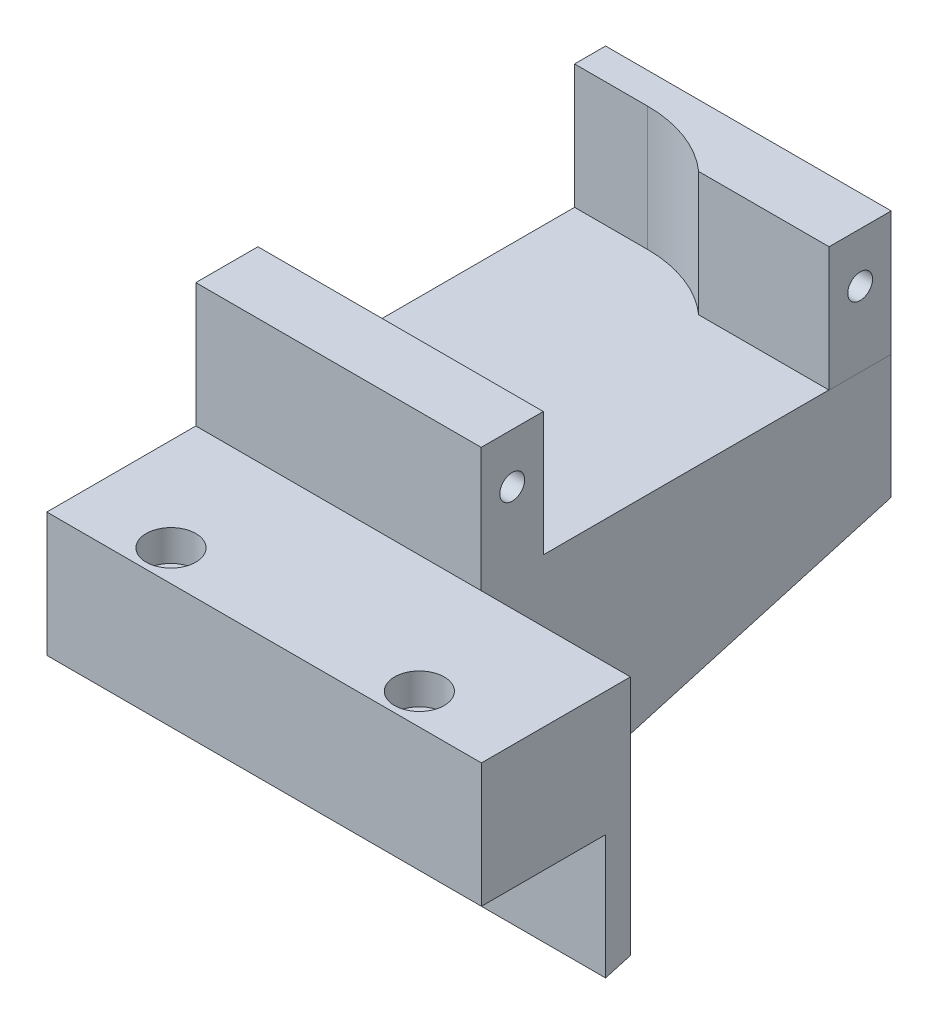
ISO-10303-21;
HEADER;
FILE_DESCRIPTION(('STEP AP214'),'2;1');
FILE_NAME('part.step','',(''),(''),'','','');
FILE_SCHEMA(('AUTOMOTIVE_DESIGN { 1 0 10303 214 1 1 1 1 }'));
ENDSEC;
DATA;
#1=APPLICATION_CONTEXT('core data for automotive mechanical design processes');
#2=APPLICATION_PROTOCOL_DEFINITION('international standard','automotive_design',2000,#1);
#3=PRODUCT_CONTEXT('',#1,'mechanical');
#4=PRODUCT('Part','Part','',(#3));
#5=PRODUCT_RELATED_PRODUCT_CATEGORY('part','',(#4));
#6=PRODUCT_DEFINITION_FORMATION('','',#4);
#7=PRODUCT_DEFINITION_CONTEXT('part definition',#1,'design');
#8=PRODUCT_DEFINITION('design','',#6,#7);
#9=PRODUCT_DEFINITION_SHAPE('','',#8);
#10=(LENGTH_UNIT() NAMED_UNIT(*) SI_UNIT(.MILLI.,.METRE.));
#11=(NAMED_UNIT(*) PLANE_ANGLE_UNIT() SI_UNIT($,.RADIAN.));
#12=(NAMED_UNIT(*) SI_UNIT($,.STERADIAN.) SOLID_ANGLE_UNIT());
#13=UNCERTAINTY_MEASURE_WITH_UNIT(LENGTH_MEASURE(1.E-05),#10,'distance_accuracy_value','');
#14=(GEOMETRIC_REPRESENTATION_CONTEXT(3) GLOBAL_UNCERTAINTY_ASSIGNED_CONTEXT((#13)) GLOBAL_UNIT_ASSIGNED_CONTEXT((#10,
#11,#12)) REPRESENTATION_CONTEXT('',''));
#15=CARTESIAN_POINT('',(0.,0.,0.));
#16=DIRECTION('',(0.,0.,1.));
#17=DIRECTION('',(1.,0.,0.));
#18=AXIS2_PLACEMENT_3D('',#15,#16,#17);
#19=CARTESIAN_POINT('',(-10.,10.,2.5));
#20=DIRECTION('',(0.,-1.,0.));
#21=DIRECTION('',(0.,0.,-1.));
#22=AXIS2_PLACEMENT_3D('',#19,#20,#21);
#23=CYLINDRICAL_SURFACE('',#22,1.1);
#24=CARTESIAN_POINT('',(-10.,0.,2.5));
#25=DIRECTION('',(0.,1.,0.));
#26=DIRECTION('',(0.,0.,1.));
#27=AXIS2_PLACEMENT_3D('',#24,#25,#26);
#28=CIRCLE('',#27,1.1);
#29=CARTESIAN_POINT('',(-10.,0.,3.6));
#30=VERTEX_POINT('',#29);
#31=EDGE_CURVE('E234',#30,#30,#28,.T.);
#32=ORIENTED_EDGE('',*,*,#31,.F.);
#33=EDGE_LOOP('',(#32));
#34=FACE_BOUND('',#33,.T.);
#35=CARTESIAN_POINT('',(-10.,7.5,2.5));
#36=DIRECTION('',(0.,1.,0.));
#37=DIRECTION('',(0.,0.,1.));
#38=AXIS2_PLACEMENT_3D('',#35,#36,#37);
#39=CIRCLE('',#38,1.1);
#40=CARTESIAN_POINT('',(-10.,7.5,3.6));
#41=VERTEX_POINT('',#40);
#42=EDGE_CURVE('E43',#41,#41,#39,.T.);
#43=ORIENTED_EDGE('',*,*,#42,.T.);
#44=EDGE_LOOP('',(#43));
#45=FACE_BOUND('',#44,.T.);
#46=ADVANCED_FACE('F39',(#34,#45),#23,.F.);
#47=CARTESIAN_POINT('',(9.99999999999999,10.,2.5));
#48=DIRECTION('',(0.,-1.,0.));
#49=DIRECTION('',(0.,0.,-1.));
#50=AXIS2_PLACEMENT_3D('',#47,#48,#49);
#51=CYLINDRICAL_SURFACE('',#50,1.1);
#52=CARTESIAN_POINT('',(9.99999999999999,0.,2.5));
#53=DIRECTION('',(0.,1.,0.));
#54=DIRECTION('',(0.,0.,1.));
#55=AXIS2_PLACEMENT_3D('',#52,#53,#54);
#56=CIRCLE('',#55,1.1);
#57=CARTESIAN_POINT('',(9.99999999999999,0.,3.6));
#58=VERTEX_POINT('',#57);
#59=EDGE_CURVE('E230',#58,#58,#56,.T.);
#60=ORIENTED_EDGE('',*,*,#59,.F.);
#61=EDGE_LOOP('',(#60));
#62=FACE_BOUND('',#61,.T.);
#63=CARTESIAN_POINT('',(9.99999999999999,7.5,2.5));
#64=DIRECTION('',(0.,1.,0.));
#65=DIRECTION('',(0.,0.,1.));
#66=AXIS2_PLACEMENT_3D('',#63,#64,#65);
#67=CIRCLE('',#66,1.1);
#68=CARTESIAN_POINT('',(9.99999999999999,7.5,3.6));
#69=VERTEX_POINT('',#68);
#70=EDGE_CURVE('E279',#69,#69,#67,.T.);
#71=ORIENTED_EDGE('',*,*,#70,.T.);
#72=EDGE_LOOP('',(#71));
#73=FACE_BOUND('',#72,.T.);
#74=ADVANCED_FACE('F464',(#62,#73),#51,.F.);
#75=CARTESIAN_POINT('',(-17.5,20.,-35.));
#76=DIRECTION('',(0.,0.,-1.));
#77=DIRECTION('',(-1.,0.,0.));
#78=AXIS2_PLACEMENT_3D('',#75,#76,#77);
#79=PLANE('',#78);
#80=DIRECTION('',(0.,1.,0.));
#81=VECTOR('',#80,1.);
#82=CARTESIAN_POINT('',(-5.00000000000001,10.,-35.));
#83=LINE('',#82,#81);
#84=CARTESIAN_POINT('',(-5.00000000000001,10.,-35.));
#85=VERTEX_POINT('',#84);
#86=CARTESIAN_POINT('',(-5.00000000000001,20.,-35.));
#87=VERTEX_POINT('',#86);
#88=EDGE_CURVE('E160',#85,#87,#83,.T.);
#89=ORIENTED_EDGE('',*,*,#88,.F.);
#90=DIRECTION('',(1.,0.,0.));
#91=VECTOR('',#90,1.);
#92=CARTESIAN_POINT('',(-17.5,10.,-35.));
#93=LINE('',#92,#91);
#94=CARTESIAN_POINT('',(5.48115762634183,10.,-35.));
#95=VERTEX_POINT('',#94);
#96=EDGE_CURVE('E168',#85,#95,#93,.T.);
#97=ORIENTED_EDGE('',*,*,#96,.T.);
#98=DIRECTION('',(-1.,0.,0.));
#99=VECTOR('',#98,1.);
#100=CARTESIAN_POINT('',(-17.5,10.,-35.));
#101=LINE('',#100,#99);
#102=CARTESIAN_POINT('',(5.49999999999999,10.,-35.));
#103=VERTEX_POINT('',#102);
#104=EDGE_CURVE('E344',#103,#95,#101,.T.);
#105=ORIENTED_EDGE('',*,*,#104,.F.);
#106=DIRECTION('',(0.,-1.,0.));
#107=VECTOR('',#106,1.);
#108=CARTESIAN_POINT('',(5.49999999999999,20.,-35.));
#109=LINE('',#108,#107);
#110=CARTESIAN_POINT('',(5.49999999999999,20.,-35.));
#111=VERTEX_POINT('',#110);
#112=EDGE_CURVE('E200',#111,#103,#109,.T.);
#113=ORIENTED_EDGE('',*,*,#112,.F.);
#114=DIRECTION('',(1.,0.,0.));
#115=VECTOR('',#114,1.);
#116=CARTESIAN_POINT('',(-17.5,20.,-35.));
#117=LINE('',#116,#115);
#118=EDGE_CURVE('E171',#87,#111,#117,.T.);
#119=ORIENTED_EDGE('',*,*,#118,.F.);
#120=EDGE_LOOP('',(#89,#97,#105,#113,#119));
#121=FACE_BOUND('',#120,.T.);
#122=ADVANCED_FACE('F166',(#121),#79,.F.);
#123=CARTESIAN_POINT('',(0.,10.,0.));
#124=DIRECTION('',(0.,1.,0.));
#125=DIRECTION('',(0.,0.,1.));
#126=AXIS2_PLACEMENT_3D('',#123,#124,#125);
#127=PLANE('',#126);
#128=ORIENTED_EDGE('',*,*,#96,.F.);
#129=CARTESIAN_POINT('',(-11.6143782776615,10.,-27.5));
#130=DIRECTION('',(0.,1.,0.));
#131=DIRECTION('',(0.,0.,1.));
#132=AXIS2_PLACEMENT_3D('',#129,#130,#131);
#133=CIRCLE('',#132,10.);
#134=CARTESIAN_POINT('',(-11.6143782776615,10.,-37.5));
#135=VERTEX_POINT('',#134);
#136=EDGE_CURVE('E64',#85,#135,#133,.T.);
#137=ORIENTED_EDGE('',*,*,#136,.T.);
#138=DIRECTION('',(-1.,0.,0.));
#139=VECTOR('',#138,1.);
#140=CARTESIAN_POINT('',(-5.00000000000001,10.,-37.5));
#141=LINE('',#140,#139);
#142=CARTESIAN_POINT('',(-17.5,10.,-37.5));
#143=VERTEX_POINT('',#142);
#144=EDGE_CURVE('E308',#135,#143,#141,.T.);
#145=ORIENTED_EDGE('',*,*,#144,.T.);
#146=DIRECTION('',(0.,0.,1.));
#147=VECTOR('',#146,1.);
#148=CARTESIAN_POINT('',(-17.5,10.,-40.));
#149=LINE('',#148,#147);
#150=CARTESIAN_POINT('',(-17.5,10.,-12.));
#151=VERTEX_POINT('',#150);
#152=EDGE_CURVE('E245',#143,#151,#149,.T.);
#153=ORIENTED_EDGE('',*,*,#152,.T.);
#154=DIRECTION('',(-1.,0.,0.));
#155=VECTOR('',#154,1.);
#156=CARTESIAN_POINT('',(-17.5,10.,-12.));
#157=LINE('',#156,#155);
#158=CARTESIAN_POINT('',(5.48115762634183,10.,-12.));
#159=VERTEX_POINT('',#158);
#160=EDGE_CURVE('E353',#159,#151,#157,.T.);
#161=ORIENTED_EDGE('',*,*,#160,.F.);
#162=DIRECTION('',(0.,0.,1.));
#163=VECTOR('',#162,1.);
#164=CARTESIAN_POINT('',(5.48115762634183,10.,-7.));
#165=LINE('',#164,#163);
#166=EDGE_CURVE('E179',#95,#159,#165,.T.);
#167=ORIENTED_EDGE('',*,*,#166,.F.);
#168=EDGE_LOOP('',(#128,#137,#145,#153,#161,#167));
#169=FACE_BOUND('',#168,.T.);
#170=ADVANCED_FACE('F177',(#169),#127,.T.);
#171=CARTESIAN_POINT('',(9.99999999999999,10.,2.5));
#172=DIRECTION('',(0.,1.,0.));
#173=DIRECTION('',(0.,0.,1.));
#174=AXIS2_PLACEMENT_3D('',#171,#172,#173);
#175=CIRCLE('',#174,2.);
#176=CARTESIAN_POINT('',(9.99999999999999,10.,4.5));
#177=VERTEX_POINT('',#176);
#178=EDGE_CURVE('E289',#177,#177,#175,.T.);
#179=ORIENTED_EDGE('',*,*,#178,.F.);
#180=EDGE_LOOP('',(#179));
#181=FACE_BOUND('',#180,.T.);
#182=CARTESIAN_POINT('',(-10.,10.,2.5));
#183=DIRECTION('',(0.,1.,0.));
#184=DIRECTION('',(0.,0.,1.));
#185=AXIS2_PLACEMENT_3D('',#182,#183,#184);
#186=CIRCLE('',#185,2.);
#187=CARTESIAN_POINT('',(-10.,10.,4.5));
#188=VERTEX_POINT('',#187);
#189=EDGE_CURVE('E301',#188,#188,#186,.T.);
#190=ORIENTED_EDGE('',*,*,#189,.F.);
#191=EDGE_LOOP('',(#190));
#192=FACE_BOUND('',#191,.T.);
#193=DIRECTION('',(1.,0.,0.));
#194=VECTOR('',#193,1.);
#195=CARTESIAN_POINT('',(5.48115762634183,10.,-7.));
#196=LINE('',#195,#194);
#197=CARTESIAN_POINT('',(5.48115762634183,10.,-7.));
#198=VERTEX_POINT('',#197);
#199=CARTESIAN_POINT('',(17.5,10.,-7.));
#200=VERTEX_POINT('',#199);
#201=EDGE_CURVE('E333',#198,#200,#196,.T.);
#202=ORIENTED_EDGE('',*,*,#201,.F.);
#203=DIRECTION('',(1.,0.,0.));
#204=VECTOR('',#203,1.);
#205=CARTESIAN_POINT('',(-17.5,10.,-7.));
#206=LINE('',#205,#204);
#207=CARTESIAN_POINT('',(-17.5,10.,-7.));
#208=VERTEX_POINT('',#207);
#209=EDGE_CURVE('E359',#208,#198,#206,.T.);
#210=ORIENTED_EDGE('',*,*,#209,.F.);
#211=CARTESIAN_POINT('',(-17.5,10.,5.));
#212=VERTEX_POINT('',#211);
#213=EDGE_CURVE('E243',#208,#212,#149,.T.);
#214=ORIENTED_EDGE('',*,*,#213,.T.);
#215=DIRECTION('',(1.,0.,0.));
#216=VECTOR('',#215,1.);
#217=CARTESIAN_POINT('',(-17.5,10.,5.));
#218=LINE('',#217,#216);
#219=CARTESIAN_POINT('',(17.5,10.,5.));
#220=VERTEX_POINT('',#219);
#221=EDGE_CURVE('E248',#212,#220,#218,.T.);
#222=ORIENTED_EDGE('',*,*,#221,.T.);
#223=DIRECTION('',(0.,0.,-1.));
#224=VECTOR('',#223,1.);
#225=CARTESIAN_POINT('',(17.5,10.,-40.));
#226=LINE('',#225,#224);
#227=EDGE_CURVE('E239',#220,#200,#226,.T.);
#228=ORIENTED_EDGE('',*,*,#227,.T.);
#229=EDGE_LOOP('',(#202,#210,#214,#222,#228));
#230=FACE_BOUND('',#229,.T.);
#231=ADVANCED_FACE('F444',(#181,#192,#230),#127,.T.);
#232=CARTESIAN_POINT('',(0.,0.,0.));
#233=DIRECTION('',(0.,1.,0.));
#234=DIRECTION('',(0.,0.,1.));
#235=AXIS2_PLACEMENT_3D('',#232,#233,#234);
#236=PLANE('',#235);
#237=ORIENTED_EDGE('',*,*,#59,.T.);
#238=EDGE_LOOP('',(#237));
#239=FACE_BOUND('',#238,.T.);
#240=ORIENTED_EDGE('',*,*,#31,.T.);
#241=EDGE_LOOP('',(#240));
#242=FACE_BOUND('',#241,.T.);
#243=DIRECTION('',(-1.,0.,0.));
#244=VECTOR('',#243,1.);
#245=CARTESIAN_POINT('',(-17.5,0.,-5.));
#246=LINE('',#245,#244);
#247=CARTESIAN_POINT('',(17.5,0.,-5.00000000000002));
#248=VERTEX_POINT('',#247);
#249=CARTESIAN_POINT('',(-17.5,0.,-5.));
#250=VERTEX_POINT('',#249);
#251=EDGE_CURVE('E215',#248,#250,#246,.T.);
#252=ORIENTED_EDGE('',*,*,#251,.F.);
#253=DIRECTION('',(0.,0.,-1.));
#254=VECTOR('',#253,1.);
#255=CARTESIAN_POINT('',(17.5,0.,-40.));
#256=LINE('',#255,#254);
#257=CARTESIAN_POINT('',(17.5,0.,5.));
#258=VERTEX_POINT('',#257);
#259=EDGE_CURVE('E238',#258,#248,#256,.T.);
#260=ORIENTED_EDGE('',*,*,#259,.F.);
#261=DIRECTION('',(1.,0.,0.));
#262=VECTOR('',#261,1.);
#263=CARTESIAN_POINT('',(-17.5,0.,5.));
#264=LINE('',#263,#262);
#265=CARTESIAN_POINT('',(-17.5,0.,5.));
#266=VERTEX_POINT('',#265);
#267=EDGE_CURVE('E244',#266,#258,#264,.T.);
#268=ORIENTED_EDGE('',*,*,#267,.F.);
#269=DIRECTION('',(0.,0.,1.));
#270=VECTOR('',#269,1.);
#271=CARTESIAN_POINT('',(-17.5,0.,-40.));
#272=LINE('',#271,#270);
#273=EDGE_CURVE('E255',#250,#266,#272,.T.);
#274=ORIENTED_EDGE('',*,*,#273,.F.);
#275=EDGE_LOOP('',(#252,#260,#268,#274));
#276=FACE_BOUND('',#275,.T.);
#277=ADVANCED_FACE('F427',(#239,#242,#276),#236,.F.);
#278=CARTESIAN_POINT('',(17.5,10.,-40.));
#279=DIRECTION('',(-1.,0.,0.));
#280=DIRECTION('',(0.,0.,1.));
#281=AXIS2_PLACEMENT_3D('',#278,#279,#280);
#282=PLANE('',#281);
#283=DIRECTION('',(0.,-0.274721127897378,0.961523947640823));
#284=VECTOR('',#283,1.);
#285=CARTESIAN_POINT('',(17.5,-10.,-5.));
#286=LINE('',#285,#284);
#287=CARTESIAN_POINT('',(17.5,-9.42857142857143,-7.));
#288=VERTEX_POINT('',#287);
#289=CARTESIAN_POINT('',(17.5,-10.,-5.));
#290=VERTEX_POINT('',#289);
#291=EDGE_CURVE('E204',#288,#290,#286,.T.);
#292=ORIENTED_EDGE('',*,*,#291,.F.);
#293=DIRECTION('',(0.,1.,0.));
#294=VECTOR('',#293,1.);
#295=CARTESIAN_POINT('',(17.5,-30.,-7.));
#296=LINE('',#295,#294);
#297=EDGE_CURVE('E345',#288,#200,#296,.T.);
#298=ORIENTED_EDGE('',*,*,#297,.T.);
#299=ORIENTED_EDGE('',*,*,#227,.F.);
#300=DIRECTION('',(0.,-1.,0.));
#301=VECTOR('',#300,1.);
#302=CARTESIAN_POINT('',(17.5,10.,5.));
#303=LINE('',#302,#301);
#304=EDGE_CURVE('E251',#220,#258,#303,.T.);
#305=ORIENTED_EDGE('',*,*,#304,.T.);
#306=ORIENTED_EDGE('',*,*,#259,.T.);
#307=DIRECTION('',(0.,1.,0.));
#308=VECTOR('',#307,1.);
#309=CARTESIAN_POINT('',(17.5,-10.,-5.));
#310=LINE('',#309,#308);
#311=EDGE_CURVE('E226',#290,#248,#310,.T.);
#312=ORIENTED_EDGE('',*,*,#311,.F.);
#313=EDGE_LOOP('',(#292,#298,#299,#305,#306,#312));
#314=FACE_BOUND('',#313,.T.);
#315=ADVANCED_FACE('F430',(#314),#282,.F.);
#316=CARTESIAN_POINT('',(-17.5,10.,-40.));
#317=DIRECTION('',(0.,0.,1.));
#318=DIRECTION('',(1.,0.,0.));
#319=AXIS2_PLACEMENT_3D('',#316,#317,#318);
#320=PLANE('',#319);
#321=DIRECTION('',(-1.,0.,0.));
#322=VECTOR('',#321,1.);
#323=CARTESIAN_POINT('',(5.48115762634183,10.,-40.));
#324=LINE('',#323,#322);
#325=CARTESIAN_POINT('',(5.49999999999999,10.,-40.));
#326=VERTEX_POINT('',#325);
#327=CARTESIAN_POINT('',(5.48115762634183,10.,-40.));
#328=VERTEX_POINT('',#327);
#329=EDGE_CURVE('E336',#326,#328,#324,.T.);
#330=ORIENTED_EDGE('',*,*,#329,.T.);
#331=DIRECTION('',(0.,1.,0.));
#332=VECTOR('',#331,1.);
#333=CARTESIAN_POINT('',(5.48115762634183,-30.,-40.));
#334=LINE('',#333,#332);
#335=CARTESIAN_POINT('',(5.48115762634183,0.,-40.));
#336=VERTEX_POINT('',#335);
#337=EDGE_CURVE('E341',#336,#328,#334,.T.);
#338=ORIENTED_EDGE('',*,*,#337,.F.);
#339=DIRECTION('',(1.,0.,0.));
#340=VECTOR('',#339,1.);
#341=CARTESIAN_POINT('',(-32.5,0.,-40.));
#342=LINE('',#341,#340);
#343=CARTESIAN_POINT('',(-17.5,0.,-40.));
#344=VERTEX_POINT('',#343);
#345=EDGE_CURVE('E207',#344,#336,#342,.T.);
#346=ORIENTED_EDGE('',*,*,#345,.F.);
#347=DIRECTION('',(0.,-1.,0.));
#348=VECTOR('',#347,1.);
#349=CARTESIAN_POINT('',(-17.5,10.,-40.));
#350=LINE('',#349,#348);
#351=CARTESIAN_POINT('',(-17.5,20.,-40.));
#352=VERTEX_POINT('',#351);
#353=EDGE_CURVE('E267',#352,#344,#350,.T.);
#354=ORIENTED_EDGE('',*,*,#353,.F.);
#355=DIRECTION('',(-1.,0.,0.));
#356=VECTOR('',#355,1.);
#357=CARTESIAN_POINT('',(-17.5,20.,-40.));
#358=LINE('',#357,#356);
#359=CARTESIAN_POINT('',(5.49999999999999,20.,-40.));
#360=VERTEX_POINT('',#359);
#361=EDGE_CURVE('E193',#360,#352,#358,.T.);
#362=ORIENTED_EDGE('',*,*,#361,.F.);
#363=DIRECTION('',(0.,-1.,0.));
#364=VECTOR('',#363,1.);
#365=CARTESIAN_POINT('',(5.49999999999999,20.,-40.));
#366=LINE('',#365,#364);
#367=EDGE_CURVE('E196',#360,#326,#366,.T.);
#368=ORIENTED_EDGE('',*,*,#367,.T.);
#369=EDGE_LOOP('',(#330,#338,#346,#354,#362,#368));
#370=FACE_BOUND('',#369,.T.);
#371=ADVANCED_FACE('F407',(#370),#320,.F.);
#372=CARTESIAN_POINT('',(-17.5,10.,-40.));
#373=DIRECTION('',(1.,0.,0.));
#374=DIRECTION('',(0.,0.,-1.));
#375=AXIS2_PLACEMENT_3D('',#372,#373,#374);
#376=PLANE('',#375);
#377=ORIENTED_EDGE('',*,*,#152,.F.);
#378=DIRECTION('',(0.,-1.,0.));
#379=VECTOR('',#378,1.);
#380=CARTESIAN_POINT('',(-17.5,10.,-37.5));
#381=LINE('',#380,#379);
#382=CARTESIAN_POINT('',(-17.5,20.,-37.5));
#383=VERTEX_POINT('',#382);
#384=EDGE_CURVE('E174',#383,#143,#381,.T.);
#385=ORIENTED_EDGE('',*,*,#384,.F.);
#386=DIRECTION('',(0.,0.,1.));
#387=VECTOR('',#386,1.);
#388=CARTESIAN_POINT('',(-17.5,20.,-40.));
#389=LINE('',#388,#387);
#390=EDGE_CURVE('E187',#352,#383,#389,.T.);
#391=ORIENTED_EDGE('',*,*,#390,.F.);
#392=ORIENTED_EDGE('',*,*,#353,.T.);
#393=DIRECTION('',(0.,-0.274721127897378,0.961523947640823));
#394=VECTOR('',#393,1.);
#395=CARTESIAN_POINT('',(-17.5,0.754716981132076,-42.6415094339623));
#396=LINE('',#395,#394);
#397=CARTESIAN_POINT('',(-17.5,-10.,-5.));
#398=VERTEX_POINT('',#397);
#399=EDGE_CURVE('E211',#344,#398,#396,.T.);
#400=ORIENTED_EDGE('',*,*,#399,.T.);
#401=DIRECTION('',(0.,1.,0.));
#402=VECTOR('',#401,1.);
#403=CARTESIAN_POINT('',(-17.5,-10.,-5.));
#404=LINE('',#403,#402);
#405=EDGE_CURVE('E219',#398,#250,#404,.T.);
#406=ORIENTED_EDGE('',*,*,#405,.T.);
#407=ORIENTED_EDGE('',*,*,#273,.T.);
#408=DIRECTION('',(0.,-1.,0.));
#409=VECTOR('',#408,1.);
#410=CARTESIAN_POINT('',(-17.5,10.,5.));
#411=LINE('',#410,#409);
#412=EDGE_CURVE('E263',#212,#266,#411,.T.);
#413=ORIENTED_EDGE('',*,*,#412,.F.);
#414=ORIENTED_EDGE('',*,*,#213,.F.);
#415=DIRECTION('',(0.,-1.,0.));
#416=VECTOR('',#415,1.);
#417=CARTESIAN_POINT('',(-17.5,20.,-7.));
#418=LINE('',#417,#416);
#419=CARTESIAN_POINT('',(-17.5,20.,-7.));
#420=VERTEX_POINT('',#419);
#421=EDGE_CURVE('E378',#420,#208,#418,.T.);
#422=ORIENTED_EDGE('',*,*,#421,.F.);
#423=DIRECTION('',(0.,0.,1.));
#424=VECTOR('',#423,1.);
#425=CARTESIAN_POINT('',(-17.5,20.,-12.));
#426=LINE('',#425,#424);
#427=CARTESIAN_POINT('',(-17.5,20.,-12.));
#428=VERTEX_POINT('',#427);
#429=EDGE_CURVE('E362',#428,#420,#426,.T.);
#430=ORIENTED_EDGE('',*,*,#429,.F.);
#431=DIRECTION('',(0.,-1.,0.));
#432=VECTOR('',#431,1.);
#433=CARTESIAN_POINT('',(-17.5,20.,-12.));
#434=LINE('',#433,#432);
#435=EDGE_CURVE('E190',#428,#151,#434,.T.);
#436=ORIENTED_EDGE('',*,*,#435,.T.);
#437=EDGE_LOOP('',(#377,#385,#391,#392,#400,#406,#407,#413,#414,#422,#430,#436));
#438=FACE_BOUND('',#437,.T.);
#439=ADVANCED_FACE('F403',(#438),#376,.F.);
#440=CARTESIAN_POINT('',(-17.5,10.,5.));
#441=DIRECTION('',(0.,0.,-1.));
#442=DIRECTION('',(-1.,0.,0.));
#443=AXIS2_PLACEMENT_3D('',#440,#441,#442);
#444=PLANE('',#443);
#445=ORIENTED_EDGE('',*,*,#267,.T.);
#446=ORIENTED_EDGE('',*,*,#304,.F.);
#447=ORIENTED_EDGE('',*,*,#221,.F.);
#448=ORIENTED_EDGE('',*,*,#412,.T.);
#449=EDGE_LOOP('',(#445,#446,#447,#448));
#450=FACE_BOUND('',#449,.T.);
#451=ADVANCED_FACE('F435',(#450),#444,.F.);
#452=CARTESIAN_POINT('',(-17.5,-10.,-5.));
#453=DIRECTION('',(0.,0.,-1.));
#454=DIRECTION('',(-1.,0.,0.));
#455=AXIS2_PLACEMENT_3D('',#452,#453,#454);
#456=PLANE('',#455);
#457=ORIENTED_EDGE('',*,*,#251,.T.);
#458=ORIENTED_EDGE('',*,*,#405,.F.);
#459=DIRECTION('',(-1.,0.,0.));
#460=VECTOR('',#459,1.);
#461=CARTESIAN_POINT('',(-17.5,-10.,-5.));
#462=LINE('',#461,#460);
#463=EDGE_CURVE('E216',#290,#398,#462,.T.);
#464=ORIENTED_EDGE('',*,*,#463,.F.);
#465=ORIENTED_EDGE('',*,*,#311,.T.);
#466=EDGE_LOOP('',(#457,#458,#464,#465));
#467=FACE_BOUND('',#466,.T.);
#468=ADVANCED_FACE('F423',(#467),#456,.F.);
#469=CARTESIAN_POINT('',(-32.5,-10.,-5.));
#470=DIRECTION('',(0.,0.961523947640823,0.274721127897378));
#471=DIRECTION('',(0.,-0.274721127897378,0.961523947640823));
#472=AXIS2_PLACEMENT_3D('',#469,#470,#471);
#473=PLANE('',#472);
#474=ORIENTED_EDGE('',*,*,#345,.T.);
#475=DIRECTION('',(0.,-0.274721127897378,0.961523947640823));
#476=VECTOR('',#475,1.);
#477=CARTESIAN_POINT('',(5.48115762634183,-10.,-5.));
#478=LINE('',#477,#476);
#479=CARTESIAN_POINT('',(5.48115762634183,-9.42857142857143,-7.));
#480=VERTEX_POINT('',#479);
#481=EDGE_CURVE('E162',#336,#480,#478,.T.);
#482=ORIENTED_EDGE('',*,*,#481,.T.);
#483=DIRECTION('',(1.,0.,0.));
#484=VECTOR('',#483,1.);
#485=CARTESIAN_POINT('',(-32.5,-9.42857142857143,-7.));
#486=LINE('',#485,#484);
#487=EDGE_CURVE('E271',#480,#288,#486,.T.);
#488=ORIENTED_EDGE('',*,*,#487,.T.);
#489=ORIENTED_EDGE('',*,*,#291,.T.);
#490=ORIENTED_EDGE('',*,*,#463,.T.);
#491=ORIENTED_EDGE('',*,*,#399,.F.);
#492=EDGE_LOOP('',(#474,#482,#488,#489,#490,#491));
#493=FACE_BOUND('',#492,.T.);
#494=ADVANCED_FACE('F418',(#493),#473,.F.);
#495=CARTESIAN_POINT('',(5.49999999999999,20.,-40.));
#496=DIRECTION('',(-1.,0.,0.));
#497=DIRECTION('',(0.,0.,1.));
#498=AXIS2_PLACEMENT_3D('',#495,#496,#497);
#499=PLANE('',#498);
#500=CARTESIAN_POINT('',(5.49999999999999,16.,-37.5));
#501=DIRECTION('',(1.,0.,0.));
#502=DIRECTION('',(0.,0.,-1.));
#503=AXIS2_PLACEMENT_3D('',#500,#501,#502);
#504=CIRCLE('',#503,0.999999999999998);
#505=CARTESIAN_POINT('',(5.49999999999999,16.,-38.5));
#506=VERTEX_POINT('',#505);
#507=EDGE_CURVE('E311',#506,#506,#504,.T.);
#508=ORIENTED_EDGE('',*,*,#507,.F.);
#509=EDGE_LOOP('',(#508));
#510=FACE_BOUND('',#509,.T.);
#511=DIRECTION('',(0.,0.,-1.));
#512=VECTOR('',#511,1.);
#513=CARTESIAN_POINT('',(5.49999999999999,10.,-40.));
#514=LINE('',#513,#512);
#515=EDGE_CURVE('E181',#103,#326,#514,.T.);
#516=ORIENTED_EDGE('',*,*,#515,.T.);
#517=ORIENTED_EDGE('',*,*,#367,.F.);
#518=DIRECTION('',(0.,0.,-1.));
#519=VECTOR('',#518,1.);
#520=CARTESIAN_POINT('',(5.49999999999999,20.,-40.));
#521=LINE('',#520,#519);
#522=EDGE_CURVE('E389',#111,#360,#521,.T.);
#523=ORIENTED_EDGE('',*,*,#522,.F.);
#524=ORIENTED_EDGE('',*,*,#112,.T.);
#525=EDGE_LOOP('',(#516,#517,#523,#524));
#526=FACE_BOUND('',#525,.T.);
#527=ADVANCED_FACE('F406',(#510,#526),#499,.F.);
#528=CARTESIAN_POINT('',(0.,20.,0.));
#529=DIRECTION('',(0.,1.,0.));
#530=DIRECTION('',(0.,0.,1.));
#531=AXIS2_PLACEMENT_3D('',#528,#529,#530);
#532=PLANE('',#531);
#533=DIRECTION('',(-1.,0.,0.));
#534=VECTOR('',#533,1.);
#535=CARTESIAN_POINT('',(-5.00000000000001,20.,-37.5));
#536=LINE('',#535,#534);
#537=CARTESIAN_POINT('',(-11.6143782776615,20.,-37.5));
#538=VERTEX_POINT('',#537);
#539=EDGE_CURVE('E173',#538,#383,#536,.T.);
#540=ORIENTED_EDGE('',*,*,#539,.F.);
#541=CARTESIAN_POINT('',(-11.6143782776615,20.,-27.5));
#542=DIRECTION('',(0.,1.,0.));
#543=DIRECTION('',(0.,0.,1.));
#544=AXIS2_PLACEMENT_3D('',#541,#542,#543);
#545=CIRCLE('',#544,10.);
#546=EDGE_CURVE('E11',#538,#87,#545,.F.);
#547=ORIENTED_EDGE('',*,*,#546,.T.);
#548=ORIENTED_EDGE('',*,*,#118,.T.);
#549=ORIENTED_EDGE('',*,*,#522,.T.);
#550=ORIENTED_EDGE('',*,*,#361,.T.);
#551=ORIENTED_EDGE('',*,*,#390,.T.);
#552=EDGE_LOOP('',(#540,#547,#548,#549,#550,#551));
#553=FACE_BOUND('',#552,.T.);
#554=ADVANCED_FACE('F398',(#553),#532,.T.);
#555=CARTESIAN_POINT('',(5.48115762634183,20.,-12.));
#556=DIRECTION('',(-1.,0.,0.));
#557=DIRECTION('',(0.,0.,1.));
#558=AXIS2_PLACEMENT_3D('',#555,#556,#557);
#559=PLANE('',#558);
#560=CARTESIAN_POINT('',(5.48115762634183,16.,-9.5));
#561=DIRECTION('',(1.,0.,0.));
#562=DIRECTION('',(0.,0.,-1.));
#563=AXIS2_PLACEMENT_3D('',#560,#561,#562);
#564=CIRCLE('',#563,1.);
#565=CARTESIAN_POINT('',(5.48115762634183,16.,-10.5));
#566=VERTEX_POINT('',#565);
#567=EDGE_CURVE('E318',#566,#566,#564,.T.);
#568=ORIENTED_EDGE('',*,*,#567,.F.);
#569=EDGE_LOOP('',(#568));
#570=FACE_BOUND('',#569,.T.);
#571=DIRECTION('',(0.,-1.,0.));
#572=VECTOR('',#571,1.);
#573=CARTESIAN_POINT('',(5.48115762634183,20.,-7.));
#574=LINE('',#573,#572);
#575=CARTESIAN_POINT('',(5.48115762634183,20.,-7.));
#576=VERTEX_POINT('',#575);
#577=EDGE_CURVE('E368',#576,#198,#574,.T.);
#578=ORIENTED_EDGE('',*,*,#577,.T.);
#579=DIRECTION('',(0.,1.,0.));
#580=VECTOR('',#579,1.);
#581=CARTESIAN_POINT('',(5.48115762634183,-30.,-7.));
#582=LINE('',#581,#580);
#583=EDGE_CURVE('E340',#480,#198,#582,.T.);
#584=ORIENTED_EDGE('',*,*,#583,.F.);
#585=ORIENTED_EDGE('',*,*,#481,.F.);
#586=ORIENTED_EDGE('',*,*,#337,.T.);
#587=EDGE_CURVE('E329',#328,#95,#165,.T.);
#588=ORIENTED_EDGE('',*,*,#587,.T.);
#589=ORIENTED_EDGE('',*,*,#166,.T.);
#590=DIRECTION('',(0.,-1.,0.));
#591=VECTOR('',#590,1.);
#592=CARTESIAN_POINT('',(5.48115762634183,20.,-12.));
#593=LINE('',#592,#591);
#594=CARTESIAN_POINT('',(5.48115762634183,20.,-12.));
#595=VERTEX_POINT('',#594);
#596=EDGE_CURVE('E182',#595,#159,#593,.T.);
#597=ORIENTED_EDGE('',*,*,#596,.F.);
#598=DIRECTION('',(0.,0.,-1.));
#599=VECTOR('',#598,1.);
#600=CARTESIAN_POINT('',(5.48115762634183,20.,-12.));
#601=LINE('',#600,#599);
#602=EDGE_CURVE('E354',#576,#595,#601,.T.);
#603=ORIENTED_EDGE('',*,*,#602,.F.);
#604=EDGE_LOOP('',(#578,#584,#585,#586,#588,#589,#597,#603));
#605=FACE_BOUND('',#604,.T.);
#606=ADVANCED_FACE('F414',(#570,#605),#559,.F.);
#607=CARTESIAN_POINT('',(-17.5,20.,-12.));
#608=DIRECTION('',(0.,0.,1.));
#609=DIRECTION('',(1.,0.,0.));
#610=AXIS2_PLACEMENT_3D('',#607,#608,#609);
#611=PLANE('',#610);
#612=ORIENTED_EDGE('',*,*,#160,.T.);
#613=ORIENTED_EDGE('',*,*,#435,.F.);
#614=DIRECTION('',(-1.,0.,0.));
#615=VECTOR('',#614,1.);
#616=CARTESIAN_POINT('',(-17.5,20.,-12.));
#617=LINE('',#616,#615);
#618=EDGE_CURVE('E358',#595,#428,#617,.T.);
#619=ORIENTED_EDGE('',*,*,#618,.F.);
#620=ORIENTED_EDGE('',*,*,#596,.T.);
#621=EDGE_LOOP('',(#612,#613,#619,#620));
#622=FACE_BOUND('',#621,.T.);
#623=ADVANCED_FACE('F453',(#622),#611,.F.);
#624=CARTESIAN_POINT('',(-17.5,20.,-7.));
#625=DIRECTION('',(0.,0.,-1.));
#626=DIRECTION('',(-1.,0.,0.));
#627=AXIS2_PLACEMENT_3D('',#624,#625,#626);
#628=PLANE('',#627);
#629=ORIENTED_EDGE('',*,*,#209,.T.);
#630=ORIENTED_EDGE('',*,*,#577,.F.);
#631=DIRECTION('',(1.,0.,0.));
#632=VECTOR('',#631,1.);
#633=CARTESIAN_POINT('',(-17.5,20.,-7.));
#634=LINE('',#633,#632);
#635=EDGE_CURVE('E365',#420,#576,#634,.T.);
#636=ORIENTED_EDGE('',*,*,#635,.F.);
#637=ORIENTED_EDGE('',*,*,#421,.T.);
#638=EDGE_LOOP('',(#629,#630,#636,#637));
#639=FACE_BOUND('',#638,.T.);
#640=ADVANCED_FACE('F447',(#639),#628,.F.);
#641=CARTESIAN_POINT('',(0.,20.,0.));
#642=DIRECTION('',(0.,1.,0.));
#643=DIRECTION('',(0.,0.,1.));
#644=AXIS2_PLACEMENT_3D('',#641,#642,#643);
#645=PLANE('',#644);
#646=ORIENTED_EDGE('',*,*,#602,.T.);
#647=ORIENTED_EDGE('',*,*,#618,.T.);
#648=ORIENTED_EDGE('',*,*,#429,.T.);
#649=ORIENTED_EDGE('',*,*,#635,.T.);
#650=EDGE_LOOP('',(#646,#647,#648,#649));
#651=FACE_BOUND('',#650,.T.);
#652=ADVANCED_FACE('F450',(#651),#645,.T.);
#653=CARTESIAN_POINT('',(5.48115762634183,-30.,-7.));
#654=DIRECTION('',(0.,0.,1.));
#655=DIRECTION('',(1.,0.,0.));
#656=AXIS2_PLACEMENT_3D('',#653,#654,#655);
#657=PLANE('',#656);
#658=ORIENTED_EDGE('',*,*,#583,.T.);
#659=ORIENTED_EDGE('',*,*,#201,.T.);
#660=ORIENTED_EDGE('',*,*,#297,.F.);
#661=ORIENTED_EDGE('',*,*,#487,.F.);
#662=EDGE_LOOP('',(#658,#659,#660,#661));
#663=FACE_BOUND('',#662,.T.);
#664=ADVANCED_FACE('F696',(#663),#657,.F.);
#665=CARTESIAN_POINT('',(0.,10.,0.));
#666=DIRECTION('',(0.,-1.,0.));
#667=DIRECTION('',(0.,0.,-1.));
#668=AXIS2_PLACEMENT_3D('',#665,#666,#667);
#669=PLANE('',#668);
#670=ORIENTED_EDGE('',*,*,#104,.T.);
#671=ORIENTED_EDGE('',*,*,#587,.F.);
#672=ORIENTED_EDGE('',*,*,#329,.F.);
#673=ORIENTED_EDGE('',*,*,#515,.F.);
#674=EDGE_LOOP('',(#670,#671,#672,#673));
#675=FACE_BOUND('',#674,.T.);
#676=ADVANCED_FACE('F412',(#675),#669,.T.);
#677=CARTESIAN_POINT('',(-4.51884237365817,16.,-9.49999999999999));
#678=DIRECTION('',(1.,0.,0.));
#679=DIRECTION('',(0.,0.,-1.));
#680=AXIS2_PLACEMENT_3D('',#677,#678,#679);
#681=CYLINDRICAL_SURFACE('',#680,1.);
#682=CARTESIAN_POINT('',(-4.51884237365817,16.,-9.49999999999999));
#683=DIRECTION('',(1.,0.,0.));
#684=DIRECTION('',(0.,0.,-1.));
#685=AXIS2_PLACEMENT_3D('',#682,#683,#684);
#686=CIRCLE('',#685,1.);
#687=CARTESIAN_POINT('',(-4.51884237365817,16.,-10.5));
#688=VERTEX_POINT('',#687);
#689=EDGE_CURVE('E322',#688,#688,#686,.T.);
#690=ORIENTED_EDGE('',*,*,#689,.F.);
#691=EDGE_LOOP('',(#690));
#692=FACE_BOUND('',#691,.T.);
#693=ORIENTED_EDGE('',*,*,#567,.T.);
#694=EDGE_LOOP('',(#693));
#695=FACE_BOUND('',#694,.T.);
#696=ADVANCED_FACE('F552',(#692,#695),#681,.F.);
#697=CARTESIAN_POINT('',(-4.51884237365817,0.,0.));
#698=DIRECTION('',(1.,0.,0.));
#699=DIRECTION('',(0.,0.,-1.));
#700=AXIS2_PLACEMENT_3D('',#697,#698,#699);
#701=PLANE('',#700);
#702=ORIENTED_EDGE('',*,*,#689,.T.);
#703=EDGE_LOOP('',(#702));
#704=FACE_BOUND('',#703,.T.);
#705=ADVANCED_FACE('F556',(#704),#701,.T.);
#706=CARTESIAN_POINT('',(-4.50000000000001,16.,-37.5));
#707=DIRECTION('',(1.,0.,0.));
#708=DIRECTION('',(0.,0.,-1.));
#709=AXIS2_PLACEMENT_3D('',#706,#707,#708);
#710=CYLINDRICAL_SURFACE('',#709,0.999999999999998);
#711=CARTESIAN_POINT('',(-4.50000000000001,16.,-37.5));
#712=DIRECTION('',(1.,0.,0.));
#713=DIRECTION('',(0.,0.,-1.));
#714=AXIS2_PLACEMENT_3D('',#711,#712,#713);
#715=CIRCLE('',#714,0.999999999999998);
#716=CARTESIAN_POINT('',(-4.50000000000001,16.,-38.5));
#717=VERTEX_POINT('',#716);
#718=EDGE_CURVE('E314',#717,#717,#715,.T.);
#719=ORIENTED_EDGE('',*,*,#718,.F.);
#720=EDGE_LOOP('',(#719));
#721=FACE_BOUND('',#720,.T.);
#722=ORIENTED_EDGE('',*,*,#507,.T.);
#723=EDGE_LOOP('',(#722));
#724=FACE_BOUND('',#723,.T.);
#725=ADVANCED_FACE('F565',(#721,#724),#710,.F.);
#726=CARTESIAN_POINT('',(-4.50000000000001,0.,0.));
#727=DIRECTION('',(1.,0.,0.));
#728=DIRECTION('',(0.,0.,-1.));
#729=AXIS2_PLACEMENT_3D('',#726,#727,#728);
#730=PLANE('',#729);
#731=ORIENTED_EDGE('',*,*,#718,.T.);
#732=EDGE_LOOP('',(#731));
#733=FACE_BOUND('',#732,.T.);
#734=ADVANCED_FACE('F575',(#733),#730,.T.);
#735=CARTESIAN_POINT('',(-5.00000000000001,10.,-37.5));
#736=DIRECTION('',(0.,0.,-1.));
#737=DIRECTION('',(-1.,0.,0.));
#738=AXIS2_PLACEMENT_3D('',#735,#736,#737);
#739=PLANE('',#738);
#740=ORIENTED_EDGE('',*,*,#144,.F.);
#741=DIRECTION('',(0.,-1.,0.));
#742=VECTOR('',#741,1.);
#743=CARTESIAN_POINT('',(-11.6143782776615,10.,-37.5));
#744=LINE('',#743,#742);
#745=EDGE_CURVE('E49',#135,#538,#744,.F.);
#746=ORIENTED_EDGE('',*,*,#745,.T.);
#747=ORIENTED_EDGE('',*,*,#539,.T.);
#748=ORIENTED_EDGE('',*,*,#384,.T.);
#749=EDGE_LOOP('',(#740,#746,#747,#748));
#750=FACE_BOUND('',#749,.T.);
#751=ADVANCED_FACE('F404',(#750),#739,.F.);
#752=CARTESIAN_POINT('',(-11.6143782776615,0.,-27.5));
#753=DIRECTION('',(0.,-1.,0.));
#754=DIRECTION('',(0.,0.,-1.));
#755=AXIS2_PLACEMENT_3D('',#752,#753,#754);
#756=CYLINDRICAL_SURFACE('',#755,10.);
#757=ORIENTED_EDGE('',*,*,#546,.F.);
#758=ORIENTED_EDGE('',*,*,#745,.F.);
#759=ORIENTED_EDGE('',*,*,#136,.F.);
#760=ORIENTED_EDGE('',*,*,#88,.T.);
#761=EDGE_LOOP('',(#757,#758,#759,#760));
#762=FACE_BOUND('',#761,.T.);
#763=ADVANCED_FACE('F41',(#762),#756,.F.);
#764=CARTESIAN_POINT('',(9.99999999999999,7.5,2.5));
#765=DIRECTION('',(0.,1.,0.));
#766=DIRECTION('',(0.,0.,1.));
#767=AXIS2_PLACEMENT_3D('',#764,#765,#766);
#768=CYLINDRICAL_SURFACE('',#767,2.);
#769=CARTESIAN_POINT('',(9.99999999999999,7.5,2.5));
#770=DIRECTION('',(0.,1.,0.));
#771=DIRECTION('',(0.,0.,1.));
#772=AXIS2_PLACEMENT_3D('',#769,#770,#771);
#773=CIRCLE('',#772,2.);
#774=CARTESIAN_POINT('',(9.99999999999999,7.5,4.5));
#775=VERTEX_POINT('',#774);
#776=EDGE_CURVE('E282',#775,#775,#773,.T.);
#777=ORIENTED_EDGE('',*,*,#776,.F.);
#778=EDGE_LOOP('',(#777));
#779=FACE_BOUND('',#778,.T.);
#780=ORIENTED_EDGE('',*,*,#178,.T.);
#781=EDGE_LOOP('',(#780));
#782=FACE_BOUND('',#781,.T.);
#783=ADVANCED_FACE('F593',(#779,#782),#768,.F.);
#784=CARTESIAN_POINT('',(9.99999999999999,7.5,2.5));
#785=DIRECTION('',(0.,1.,0.));
#786=DIRECTION('',(0.,0.,1.));
#787=AXIS2_PLACEMENT_3D('',#784,#785,#786);
#788=PLANE('',#787);
#789=ORIENTED_EDGE('',*,*,#70,.F.);
#790=EDGE_LOOP('',(#789));
#791=FACE_BOUND('',#790,.T.);
#792=ORIENTED_EDGE('',*,*,#776,.T.);
#793=EDGE_LOOP('',(#792));
#794=FACE_BOUND('',#793,.T.);
#795=ADVANCED_FACE('F599',(#791,#794),#788,.T.);
#796=CARTESIAN_POINT('',(-10.,7.5,2.5));
#797=DIRECTION('',(0.,1.,0.));
#798=DIRECTION('',(0.,0.,1.));
#799=AXIS2_PLACEMENT_3D('',#796,#797,#798);
#800=CYLINDRICAL_SURFACE('',#799,2.);
#801=CARTESIAN_POINT('',(-10.,7.5,2.5));
#802=DIRECTION('',(0.,1.,0.));
#803=DIRECTION('',(0.,0.,1.));
#804=AXIS2_PLACEMENT_3D('',#801,#802,#803);
#805=CIRCLE('',#804,2.);
#806=CARTESIAN_POINT('',(-10.,7.5,4.5));
#807=VERTEX_POINT('',#806);
#808=EDGE_CURVE('E295',#807,#807,#805,.T.);
#809=ORIENTED_EDGE('',*,*,#808,.F.);
#810=EDGE_LOOP('',(#809));
#811=FACE_BOUND('',#810,.T.);
#812=ORIENTED_EDGE('',*,*,#189,.T.);
#813=EDGE_LOOP('',(#812));
#814=FACE_BOUND('',#813,.T.);
#815=ADVANCED_FACE('F608',(#811,#814),#800,.F.);
#816=CARTESIAN_POINT('',(-10.,7.5,2.5));
#817=DIRECTION('',(0.,1.,0.));
#818=DIRECTION('',(0.,0.,1.));
#819=AXIS2_PLACEMENT_3D('',#816,#817,#818);
#820=PLANE('',#819);
#821=ORIENTED_EDGE('',*,*,#42,.F.);
#822=EDGE_LOOP('',(#821));
#823=FACE_BOUND('',#822,.T.);
#824=ORIENTED_EDGE('',*,*,#808,.T.);
#825=EDGE_LOOP('',(#824));
#826=FACE_BOUND('',#825,.T.);
#827=ADVANCED_FACE('F616',(#823,#826),#820,.T.);
#828=CLOSED_SHELL('',(#46,#74,#122,#170,#231,#277,#315,#371,#439,#451,#468,#494,#527,#554,#606,
#623,#640,#652,#664,#676,#696,#705,#725,#734,#751,#763,#783,#795,#815,#827));
#829=MANIFOLD_SOLID_BREP('B2',#828);
#830=ADVANCED_BREP_SHAPE_REPRESENTATION('',(#18,#829),#14);
#831=SHAPE_DEFINITION_REPRESENTATION(#9,#830);
ENDSEC;
END-ISO-10303-21;
